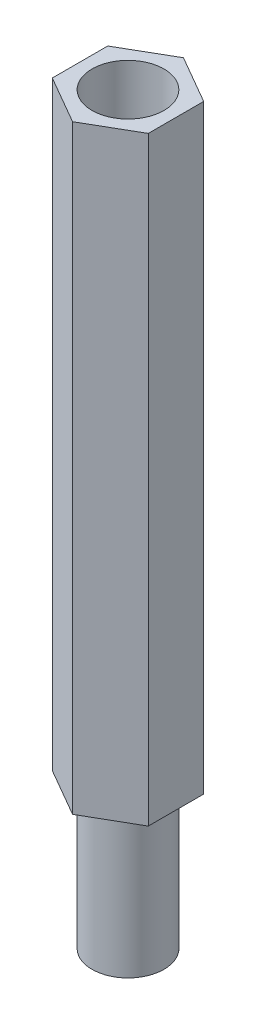
ISO-10303-21;
HEADER;
FILE_DESCRIPTION(('STEP AP214'),'2;1');
FILE_NAME('part.step','',(''),(''),'','','');
FILE_SCHEMA(('AUTOMOTIVE_DESIGN { 1 0 10303 214 1 1 1 1 }'));
ENDSEC;
DATA;
#1=APPLICATION_CONTEXT('core data for automotive mechanical design processes');
#2=APPLICATION_PROTOCOL_DEFINITION('international standard','automotive_design',2000,#1);
#3=PRODUCT_CONTEXT('',#1,'mechanical');
#4=PRODUCT('Part','Part','',(#3));
#5=PRODUCT_RELATED_PRODUCT_CATEGORY('part','',(#4));
#6=PRODUCT_DEFINITION_FORMATION('','',#4);
#7=PRODUCT_DEFINITION_CONTEXT('part definition',#1,'design');
#8=PRODUCT_DEFINITION('design','',#6,#7);
#9=PRODUCT_DEFINITION_SHAPE('','',#8);
#10=(LENGTH_UNIT() NAMED_UNIT(*) SI_UNIT(.MILLI.,.METRE.));
#11=(NAMED_UNIT(*) PLANE_ANGLE_UNIT() SI_UNIT($,.RADIAN.));
#12=(NAMED_UNIT(*) SI_UNIT($,.STERADIAN.) SOLID_ANGLE_UNIT());
#13=UNCERTAINTY_MEASURE_WITH_UNIT(LENGTH_MEASURE(1.E-05),#10,'distance_accuracy_value','');
#14=(GEOMETRIC_REPRESENTATION_CONTEXT(3) GLOBAL_UNCERTAINTY_ASSIGNED_CONTEXT((#13)) GLOBAL_UNIT_ASSIGNED_CONTEXT((#10,
#11,#12)) REPRESENTATION_CONTEXT('',''));
#15=CARTESIAN_POINT('',(0.,0.,0.));
#16=DIRECTION('',(0.,0.,1.));
#17=DIRECTION('',(1.,0.,0.));
#18=AXIS2_PLACEMENT_3D('',#15,#16,#17);
#19=CARTESIAN_POINT('',(-2.,25.,1.15470053837925));
#20=DIRECTION('',(0.5,0.,-0.866025403784439));
#21=DIRECTION('',(-0.866025403784439,0.,-0.5));
#22=AXIS2_PLACEMENT_3D('',#19,#20,#21);
#23=PLANE('',#22);
#24=DIRECTION('',(0.866025403784439,0.,0.5));
#25=VECTOR('',#24,1.);
#26=CARTESIAN_POINT('',(-2.,0.,1.15470053837925));
#27=LINE('',#26,#25);
#28=CARTESIAN_POINT('',(-2.,0.,1.15470053837925));
#29=VERTEX_POINT('',#28);
#30=CARTESIAN_POINT('',(0.,0.,2.3094010767585));
#31=VERTEX_POINT('',#30);
#32=EDGE_CURVE('E127',#29,#31,#27,.T.);
#33=ORIENTED_EDGE('',*,*,#32,.T.);
#34=DIRECTION('',(0.,-1.,0.));
#35=VECTOR('',#34,1.);
#36=CARTESIAN_POINT('',(0.,25.,2.3094010767585));
#37=LINE('',#36,#35);
#38=CARTESIAN_POINT('',(0.,25.,2.3094010767585));
#39=VERTEX_POINT('',#38);
#40=EDGE_CURVE('E44',#39,#31,#37,.T.);
#41=ORIENTED_EDGE('',*,*,#40,.F.);
#42=DIRECTION('',(0.866025403784439,0.,0.5));
#43=VECTOR('',#42,1.);
#44=CARTESIAN_POINT('',(-2.,25.,1.15470053837925));
#45=LINE('',#44,#43);
#46=CARTESIAN_POINT('',(-2.,25.,1.15470053837925));
#47=VERTEX_POINT('',#46);
#48=EDGE_CURVE('E138',#47,#39,#45,.T.);
#49=ORIENTED_EDGE('',*,*,#48,.F.);
#50=DIRECTION('',(0.,-1.,0.));
#51=VECTOR('',#50,1.);
#52=CARTESIAN_POINT('',(-2.,25.,1.15470053837925));
#53=LINE('',#52,#51);
#54=EDGE_CURVE('E123',#47,#29,#53,.T.);
#55=ORIENTED_EDGE('',*,*,#54,.T.);
#56=EDGE_LOOP('',(#33,#41,#49,#55));
#57=FACE_BOUND('',#56,.T.);
#58=ADVANCED_FACE('F41',(#57),#23,.F.);
#59=CARTESIAN_POINT('',(0.,25.,2.3094010767585));
#60=DIRECTION('',(-0.5,0.,-0.866025403784438));
#61=DIRECTION('',(-0.866025403784439,0.,0.5));
#62=AXIS2_PLACEMENT_3D('',#59,#60,#61);
#63=PLANE('',#62);
#64=DIRECTION('',(0.866025403784438,0.,-0.5));
#65=VECTOR('',#64,1.);
#66=CARTESIAN_POINT('',(0.,0.,2.3094010767585));
#67=LINE('',#66,#65);
#68=CARTESIAN_POINT('',(2.,0.,1.15470053837925));
#69=VERTEX_POINT('',#68);
#70=EDGE_CURVE('E130',#31,#69,#67,.T.);
#71=ORIENTED_EDGE('',*,*,#70,.T.);
#72=DIRECTION('',(0.,-1.,0.));
#73=VECTOR('',#72,1.);
#74=CARTESIAN_POINT('',(2.,25.,1.15470053837925));
#75=LINE('',#74,#73);
#76=CARTESIAN_POINT('',(2.,25.,1.15470053837925));
#77=VERTEX_POINT('',#76);
#78=EDGE_CURVE('E141',#77,#69,#75,.T.);
#79=ORIENTED_EDGE('',*,*,#78,.F.);
#80=DIRECTION('',(0.866025403784438,0.,-0.5));
#81=VECTOR('',#80,1.);
#82=CARTESIAN_POINT('',(0.,25.,2.3094010767585));
#83=LINE('',#82,#81);
#84=EDGE_CURVE('E96',#39,#77,#83,.T.);
#85=ORIENTED_EDGE('',*,*,#84,.F.);
#86=ORIENTED_EDGE('',*,*,#40,.T.);
#87=EDGE_LOOP('',(#71,#79,#85,#86));
#88=FACE_BOUND('',#87,.T.);
#89=ADVANCED_FACE('F146',(#88),#63,.F.);
#90=CARTESIAN_POINT('',(2.,25.,1.15470053837925));
#91=DIRECTION('',(-1.,0.,0.));
#92=DIRECTION('',(0.,0.,1.));
#93=AXIS2_PLACEMENT_3D('',#90,#91,#92);
#94=PLANE('',#93);
#95=DIRECTION('',(0.,0.,-1.));
#96=VECTOR('',#95,1.);
#97=CARTESIAN_POINT('',(2.,0.,1.15470053837925));
#98=LINE('',#97,#96);
#99=CARTESIAN_POINT('',(2.,0.,-1.15470053837925));
#100=VERTEX_POINT('',#99);
#101=EDGE_CURVE('E133',#69,#100,#98,.T.);
#102=ORIENTED_EDGE('',*,*,#101,.T.);
#103=DIRECTION('',(0.,-1.,0.));
#104=VECTOR('',#103,1.);
#105=CARTESIAN_POINT('',(2.,25.,-1.15470053837925));
#106=LINE('',#105,#104);
#107=CARTESIAN_POINT('',(2.,25.,-1.15470053837925));
#108=VERTEX_POINT('',#107);
#109=EDGE_CURVE('E118',#108,#100,#106,.T.);
#110=ORIENTED_EDGE('',*,*,#109,.F.);
#111=DIRECTION('',(0.,0.,-1.));
#112=VECTOR('',#111,1.);
#113=CARTESIAN_POINT('',(2.,25.,1.15470053837925));
#114=LINE('',#113,#112);
#115=EDGE_CURVE('E109',#77,#108,#114,.T.);
#116=ORIENTED_EDGE('',*,*,#115,.F.);
#117=ORIENTED_EDGE('',*,*,#78,.T.);
#118=EDGE_LOOP('',(#102,#110,#116,#117));
#119=FACE_BOUND('',#118,.T.);
#120=ADVANCED_FACE('F152',(#119),#94,.F.);
#121=CARTESIAN_POINT('',(2.,25.,-1.15470053837925));
#122=DIRECTION('',(-0.5,0.,0.866025403784439));
#123=DIRECTION('',(0.866025403784439,0.,0.5));
#124=AXIS2_PLACEMENT_3D('',#121,#122,#123);
#125=PLANE('',#124);
#126=DIRECTION('',(-0.866025403784439,0.,-0.5));
#127=VECTOR('',#126,1.);
#128=CARTESIAN_POINT('',(2.,0.,-1.15470053837925));
#129=LINE('',#128,#127);
#130=CARTESIAN_POINT('',(0.,0.,-2.3094010767585));
#131=VERTEX_POINT('',#130);
#132=EDGE_CURVE('E117',#100,#131,#129,.T.);
#133=ORIENTED_EDGE('',*,*,#132,.T.);
#134=DIRECTION('',(0.,-1.,0.));
#135=VECTOR('',#134,1.);
#136=CARTESIAN_POINT('',(0.,25.,-2.3094010767585));
#137=LINE('',#136,#135);
#138=CARTESIAN_POINT('',(0.,25.,-2.3094010767585));
#139=VERTEX_POINT('',#138);
#140=EDGE_CURVE('E114',#139,#131,#137,.T.);
#141=ORIENTED_EDGE('',*,*,#140,.F.);
#142=DIRECTION('',(-0.866025403784439,0.,-0.5));
#143=VECTOR('',#142,1.);
#144=CARTESIAN_POINT('',(2.,25.,-1.15470053837925));
#145=LINE('',#144,#143);
#146=EDGE_CURVE('E103',#108,#139,#145,.T.);
#147=ORIENTED_EDGE('',*,*,#146,.F.);
#148=ORIENTED_EDGE('',*,*,#109,.T.);
#149=EDGE_LOOP('',(#133,#141,#147,#148));
#150=FACE_BOUND('',#149,.T.);
#151=ADVANCED_FACE('F115',(#150),#125,.F.);
#152=CARTESIAN_POINT('',(0.,25.,-2.3094010767585));
#153=DIRECTION('',(0.5,0.,0.866025403784438));
#154=DIRECTION('',(0.866025403784438,0.,-0.5));
#155=AXIS2_PLACEMENT_3D('',#152,#153,#154);
#156=PLANE('',#155);
#157=DIRECTION('',(-0.866025403784439,0.,0.5));
#158=VECTOR('',#157,1.);
#159=CARTESIAN_POINT('',(0.,0.,-2.3094010767585));
#160=LINE('',#159,#158);
#161=CARTESIAN_POINT('',(-2.,0.,-1.15470053837925));
#162=VERTEX_POINT('',#161);
#163=EDGE_CURVE('E81',#131,#162,#160,.T.);
#164=ORIENTED_EDGE('',*,*,#163,.T.);
#165=DIRECTION('',(0.,-1.,0.));
#166=VECTOR('',#165,1.);
#167=CARTESIAN_POINT('',(-2.,25.,-1.15470053837925));
#168=LINE('',#167,#166);
#169=CARTESIAN_POINT('',(-2.,25.,-1.15470053837925));
#170=VERTEX_POINT('',#169);
#171=EDGE_CURVE('E119',#170,#162,#168,.T.);
#172=ORIENTED_EDGE('',*,*,#171,.F.);
#173=DIRECTION('',(-0.866025403784439,0.,0.5));
#174=VECTOR('',#173,1.);
#175=CARTESIAN_POINT('',(0.,25.,-2.3094010767585));
#176=LINE('',#175,#174);
#177=EDGE_CURVE('E107',#139,#170,#176,.T.);
#178=ORIENTED_EDGE('',*,*,#177,.F.);
#179=ORIENTED_EDGE('',*,*,#140,.T.);
#180=EDGE_LOOP('',(#164,#172,#178,#179));
#181=FACE_BOUND('',#180,.T.);
#182=ADVANCED_FACE('F121',(#181),#156,.F.);
#183=CARTESIAN_POINT('',(-2.,25.,-1.15470053837925));
#184=DIRECTION('',(1.,0.,0.));
#185=DIRECTION('',(0.,0.,-1.));
#186=AXIS2_PLACEMENT_3D('',#183,#184,#185);
#187=PLANE('',#186);
#188=DIRECTION('',(0.,0.,1.));
#189=VECTOR('',#188,1.);
#190=CARTESIAN_POINT('',(-2.,0.,-1.15470053837925));
#191=LINE('',#190,#189);
#192=EDGE_CURVE('E87',#162,#29,#191,.T.);
#193=ORIENTED_EDGE('',*,*,#192,.T.);
#194=ORIENTED_EDGE('',*,*,#54,.F.);
#195=DIRECTION('',(0.,0.,1.));
#196=VECTOR('',#195,1.);
#197=CARTESIAN_POINT('',(-2.,25.,-1.15470053837925));
#198=LINE('',#197,#196);
#199=EDGE_CURVE('E58',#170,#47,#198,.T.);
#200=ORIENTED_EDGE('',*,*,#199,.F.);
#201=ORIENTED_EDGE('',*,*,#171,.T.);
#202=EDGE_LOOP('',(#193,#194,#200,#201));
#203=FACE_BOUND('',#202,.T.);
#204=ADVANCED_FACE('F212',(#203),#187,.F.);
#205=CARTESIAN_POINT('',(0.,25.,0.));
#206=DIRECTION('',(0.,1.,0.));
#207=DIRECTION('',(0.,0.,1.));
#208=AXIS2_PLACEMENT_3D('',#205,#206,#207);
#209=PLANE('',#208);
#210=CARTESIAN_POINT('',(0.,25.,0.));
#211=DIRECTION('',(0.,1.,0.));
#212=DIRECTION('',(0.,0.,1.));
#213=AXIS2_PLACEMENT_3D('',#210,#211,#212);
#214=CIRCLE('',#213,1.5);
#215=CARTESIAN_POINT('',(0.,25.,1.5));
#216=VERTEX_POINT('',#215);
#217=EDGE_CURVE('E155',#216,#216,#214,.T.);
#218=ORIENTED_EDGE('',*,*,#217,.F.);
#219=EDGE_LOOP('',(#218));
#220=FACE_BOUND('',#219,.T.);
#221=ORIENTED_EDGE('',*,*,#48,.T.);
#222=ORIENTED_EDGE('',*,*,#84,.T.);
#223=ORIENTED_EDGE('',*,*,#115,.T.);
#224=ORIENTED_EDGE('',*,*,#146,.T.);
#225=ORIENTED_EDGE('',*,*,#177,.T.);
#226=ORIENTED_EDGE('',*,*,#199,.T.);
#227=EDGE_LOOP('',(#221,#222,#223,#224,#225,#226));
#228=FACE_BOUND('',#227,.T.);
#229=ADVANCED_FACE('F105',(#220,#228),#209,.T.);
#230=CARTESIAN_POINT('',(0.,0.,0.));
#231=DIRECTION('',(0.,1.,0.));
#232=DIRECTION('',(0.,0.,1.));
#233=AXIS2_PLACEMENT_3D('',#230,#231,#232);
#234=PLANE('',#233);
#235=CARTESIAN_POINT('',(0.,0.,0.));
#236=DIRECTION('',(0.,-1.,0.));
#237=DIRECTION('',(0.,0.,-1.));
#238=AXIS2_PLACEMENT_3D('',#235,#236,#237);
#239=CIRCLE('',#238,1.5);
#240=CARTESIAN_POINT('',(0.,0.,-1.5));
#241=VERTEX_POINT('',#240);
#242=EDGE_CURVE('E12',#241,#241,#239,.T.);
#243=ORIENTED_EDGE('',*,*,#242,.F.);
#244=EDGE_LOOP('',(#243));
#245=FACE_BOUND('',#244,.T.);
#246=ORIENTED_EDGE('',*,*,#32,.F.);
#247=ORIENTED_EDGE('',*,*,#192,.F.);
#248=ORIENTED_EDGE('',*,*,#163,.F.);
#249=ORIENTED_EDGE('',*,*,#132,.F.);
#250=ORIENTED_EDGE('',*,*,#101,.F.);
#251=ORIENTED_EDGE('',*,*,#70,.F.);
#252=EDGE_LOOP('',(#246,#247,#248,#249,#250,#251));
#253=FACE_BOUND('',#252,.T.);
#254=ADVANCED_FACE('F151',(#245,#253),#234,.F.);
#255=CARTESIAN_POINT('',(0.,6.,0.));
#256=DIRECTION('',(0.,1.,0.));
#257=DIRECTION('',(0.,0.,1.));
#258=AXIS2_PLACEMENT_3D('',#255,#256,#257);
#259=CYLINDRICAL_SURFACE('',#258,1.5);
#260=CARTESIAN_POINT('',(0.,6.,0.));
#261=DIRECTION('',(0.,1.,0.));
#262=DIRECTION('',(0.,0.,1.));
#263=AXIS2_PLACEMENT_3D('',#260,#261,#262);
#264=CIRCLE('',#263,1.5);
#265=CARTESIAN_POINT('',(0.,6.,1.5));
#266=VERTEX_POINT('',#265);
#267=EDGE_CURVE('E131',#266,#266,#264,.T.);
#268=ORIENTED_EDGE('',*,*,#267,.F.);
#269=EDGE_LOOP('',(#268));
#270=FACE_BOUND('',#269,.T.);
#271=ORIENTED_EDGE('',*,*,#217,.T.);
#272=EDGE_LOOP('',(#271));
#273=FACE_BOUND('',#272,.T.);
#274=ADVANCED_FACE('F204',(#270,#273),#259,.F.);
#275=CARTESIAN_POINT('',(0.,6.,0.));
#276=DIRECTION('',(0.,1.,0.));
#277=DIRECTION('',(0.,0.,1.));
#278=AXIS2_PLACEMENT_3D('',#275,#276,#277);
#279=PLANE('',#278);
#280=ORIENTED_EDGE('',*,*,#267,.T.);
#281=EDGE_LOOP('',(#280));
#282=FACE_BOUND('',#281,.T.);
#283=ADVANCED_FACE('F199',(#282),#279,.T.);
#284=CARTESIAN_POINT('',(0.,-6.,0.));
#285=DIRECTION('',(0.,1.,0.));
#286=DIRECTION('',(0.,0.,1.));
#287=AXIS2_PLACEMENT_3D('',#284,#285,#286);
#288=CYLINDRICAL_SURFACE('',#287,1.5);
#289=CARTESIAN_POINT('',(0.,-6.,0.));
#290=DIRECTION('',(0.,-1.,0.));
#291=DIRECTION('',(0.,0.,-1.));
#292=AXIS2_PLACEMENT_3D('',#289,#290,#291);
#293=CIRCLE('',#292,1.5);
#294=CARTESIAN_POINT('',(0.,-6.,-1.5));
#295=VERTEX_POINT('',#294);
#296=EDGE_CURVE('E159',#295,#295,#293,.T.);
#297=ORIENTED_EDGE('',*,*,#296,.F.);
#298=EDGE_LOOP('',(#297));
#299=FACE_BOUND('',#298,.T.);
#300=ORIENTED_EDGE('',*,*,#242,.T.);
#301=EDGE_LOOP('',(#300));
#302=FACE_BOUND('',#301,.T.);
#303=ADVANCED_FACE('F196',(#299,#302),#288,.T.);
#304=CARTESIAN_POINT('',(0.,-6.,0.));
#305=DIRECTION('',(0.,-1.,0.));
#306=DIRECTION('',(0.,0.,-1.));
#307=AXIS2_PLACEMENT_3D('',#304,#305,#306);
#308=PLANE('',#307);
#309=ORIENTED_EDGE('',*,*,#296,.T.);
#310=EDGE_LOOP('',(#309));
#311=FACE_BOUND('',#310,.T.);
#312=ADVANCED_FACE('F194',(#311),#308,.T.);
#313=CLOSED_SHELL('',(#58,#89,#120,#151,#182,#204,#229,#254,#274,#283,#303,#312));
#314=MANIFOLD_SOLID_BREP('B2',#313);
#315=ADVANCED_BREP_SHAPE_REPRESENTATION('',(#18,#314),#14);
#316=SHAPE_DEFINITION_REPRESENTATION(#9,#315);
ENDSEC;
END-ISO-10303-21;
